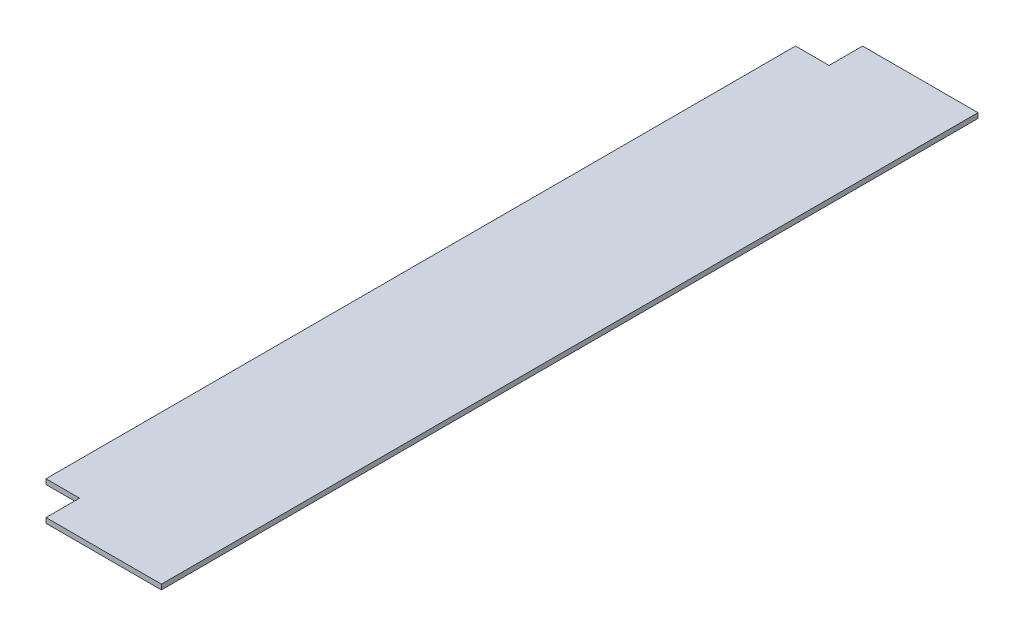
ISO-10303-21;
HEADER;
FILE_DESCRIPTION(('STEP AP214'),'2;1');
FILE_NAME('part.step','',(''),(''),'','','');
FILE_SCHEMA(('AUTOMOTIVE_DESIGN { 1 0 10303 214 1 1 1 1 }'));
ENDSEC;
DATA;
#1=APPLICATION_CONTEXT('core data for automotive mechanical design processes');
#2=APPLICATION_PROTOCOL_DEFINITION('international standard','automotive_design',2000,#1);
#3=PRODUCT_CONTEXT('',#1,'mechanical');
#4=PRODUCT('Part','Part','',(#3));
#5=PRODUCT_RELATED_PRODUCT_CATEGORY('part','',(#4));
#6=PRODUCT_DEFINITION_FORMATION('','',#4);
#7=PRODUCT_DEFINITION_CONTEXT('part definition',#1,'design');
#8=PRODUCT_DEFINITION('design','',#6,#7);
#9=PRODUCT_DEFINITION_SHAPE('','',#8);
#10=(LENGTH_UNIT() NAMED_UNIT(*) SI_UNIT(.MILLI.,.METRE.));
#11=(NAMED_UNIT(*) PLANE_ANGLE_UNIT() SI_UNIT($,.RADIAN.));
#12=(NAMED_UNIT(*) SI_UNIT($,.STERADIAN.) SOLID_ANGLE_UNIT());
#13=UNCERTAINTY_MEASURE_WITH_UNIT(LENGTH_MEASURE(1.E-05),#10,'distance_accuracy_value','');
#14=(GEOMETRIC_REPRESENTATION_CONTEXT(3) GLOBAL_UNCERTAINTY_ASSIGNED_CONTEXT((#13)) GLOBAL_UNIT_ASSIGNED_CONTEXT((#10,
#11,#12)) REPRESENTATION_CONTEXT('',''));
#15=CARTESIAN_POINT('',(0.,0.,0.));
#16=DIRECTION('',(0.,0.,1.));
#17=DIRECTION('',(1.,0.,0.));
#18=AXIS2_PLACEMENT_3D('',#15,#16,#17);
#19=CARTESIAN_POINT('',(36.1974551956955,4.5,-365.));
#20=DIRECTION('',(-1.,0.,0.));
#21=DIRECTION('',(0.,0.,1.));
#22=AXIS2_PLACEMENT_3D('',#19,#20,#21);
#23=PLANE('',#22);
#24=DIRECTION('',(0.,0.,-1.));
#25=VECTOR('',#24,1.);
#26=CARTESIAN_POINT('',(36.1974551956955,0.,-365.));
#27=LINE('',#26,#25);
#28=CARTESIAN_POINT('',(36.1974551956956,0.,365.));
#29=VERTEX_POINT('',#28);
#30=CARTESIAN_POINT('',(36.1974551956955,0.,-365.));
#31=VERTEX_POINT('',#30);
#32=EDGE_CURVE('E140',#29,#31,#27,.T.);
#33=ORIENTED_EDGE('',*,*,#32,.T.);
#34=DIRECTION('',(0.,-1.,0.));
#35=VECTOR('',#34,1.);
#36=CARTESIAN_POINT('',(36.1974551956955,4.5,-365.));
#37=LINE('',#36,#35);
#38=CARTESIAN_POINT('',(36.1974551956955,4.5,-365.));
#39=VERTEX_POINT('',#38);
#40=EDGE_CURVE('E11',#39,#31,#37,.T.);
#41=ORIENTED_EDGE('',*,*,#40,.F.);
#42=DIRECTION('',(0.,0.,-1.));
#43=VECTOR('',#42,1.);
#44=CARTESIAN_POINT('',(36.1974551956955,4.5,-365.));
#45=LINE('',#44,#43);
#46=CARTESIAN_POINT('',(36.1974551956956,4.5,365.));
#47=VERTEX_POINT('',#46);
#48=EDGE_CURVE('E162',#47,#39,#45,.T.);
#49=ORIENTED_EDGE('',*,*,#48,.F.);
#50=DIRECTION('',(0.,-1.,0.));
#51=VECTOR('',#50,1.);
#52=CARTESIAN_POINT('',(36.1974551956956,4.5,365.));
#53=LINE('',#52,#51);
#54=EDGE_CURVE('E136',#47,#29,#53,.T.);
#55=ORIENTED_EDGE('',*,*,#54,.T.);
#56=EDGE_LOOP('',(#33,#41,#49,#55));
#57=FACE_BOUND('',#56,.T.);
#58=ADVANCED_FACE('F39',(#57),#23,.F.);
#59=CARTESIAN_POINT('',(-66.9625448043045,4.5,-365.));
#60=DIRECTION('',(0.,0.,1.));
#61=DIRECTION('',(1.,0.,0.));
#62=AXIS2_PLACEMENT_3D('',#59,#60,#61);
#63=PLANE('',#62);
#64=DIRECTION('',(-1.,0.,0.));
#65=VECTOR('',#64,1.);
#66=CARTESIAN_POINT('',(-66.9625448043045,0.,-365.));
#67=LINE('',#66,#65);
#68=CARTESIAN_POINT('',(-66.9625448043045,0.,-365.));
#69=VERTEX_POINT('',#68);
#70=EDGE_CURVE('E144',#31,#69,#67,.T.);
#71=ORIENTED_EDGE('',*,*,#70,.T.);
#72=DIRECTION('',(0.,-1.,0.));
#73=VECTOR('',#72,1.);
#74=CARTESIAN_POINT('',(-66.9625448043045,4.5,-365.));
#75=LINE('',#74,#73);
#76=CARTESIAN_POINT('',(-66.9625448043045,4.5,-365.));
#77=VERTEX_POINT('',#76);
#78=EDGE_CURVE('E48',#77,#69,#75,.T.);
#79=ORIENTED_EDGE('',*,*,#78,.F.);
#80=DIRECTION('',(-1.,0.,0.));
#81=VECTOR('',#80,1.);
#82=CARTESIAN_POINT('',(-66.9625448043045,4.5,-365.));
#83=LINE('',#82,#81);
#84=EDGE_CURVE('E99',#39,#77,#83,.T.);
#85=ORIENTED_EDGE('',*,*,#84,.F.);
#86=ORIENTED_EDGE('',*,*,#40,.T.);
#87=EDGE_LOOP('',(#71,#79,#85,#86));
#88=FACE_BOUND('',#87,.T.);
#89=ADVANCED_FACE('F208',(#88),#63,.F.);
#90=CARTESIAN_POINT('',(-66.9625448043045,4.5,-365.));
#91=DIRECTION('',(1.,0.,0.));
#92=DIRECTION('',(0.,0.,-1.));
#93=AXIS2_PLACEMENT_3D('',#90,#91,#92);
#94=PLANE('',#93);
#95=DIRECTION('',(0.,0.,1.));
#96=VECTOR('',#95,1.);
#97=CARTESIAN_POINT('',(-66.9625448043045,0.,-365.));
#98=LINE('',#97,#96);
#99=CARTESIAN_POINT('',(-66.9625448043045,0.,-335.));
#100=VERTEX_POINT('',#99);
#101=EDGE_CURVE('E147',#69,#100,#98,.T.);
#102=ORIENTED_EDGE('',*,*,#101,.T.);
#103=DIRECTION('',(0.,-1.,0.));
#104=VECTOR('',#103,1.);
#105=CARTESIAN_POINT('',(-66.9625448043045,4.5,-335.));
#106=LINE('',#105,#104);
#107=CARTESIAN_POINT('',(-66.9625448043045,4.5,-335.));
#108=VERTEX_POINT('',#107);
#109=EDGE_CURVE('E173',#108,#100,#106,.T.);
#110=ORIENTED_EDGE('',*,*,#109,.F.);
#111=DIRECTION('',(0.,0.,1.));
#112=VECTOR('',#111,1.);
#113=CARTESIAN_POINT('',(-66.9625448043045,4.5,-365.));
#114=LINE('',#113,#112);
#115=EDGE_CURVE('E183',#77,#108,#114,.T.);
#116=ORIENTED_EDGE('',*,*,#115,.F.);
#117=ORIENTED_EDGE('',*,*,#78,.T.);
#118=EDGE_LOOP('',(#102,#110,#116,#117));
#119=FACE_BOUND('',#118,.T.);
#120=ADVANCED_FACE('F181',(#119),#94,.F.);
#121=CARTESIAN_POINT('',(-96.9625448043045,4.5,-335.));
#122=DIRECTION('',(0.,0.,1.));
#123=DIRECTION('',(1.,0.,0.));
#124=AXIS2_PLACEMENT_3D('',#121,#122,#123);
#125=PLANE('',#124);
#126=DIRECTION('',(-1.,0.,0.));
#127=VECTOR('',#126,1.);
#128=CARTESIAN_POINT('',(-96.9625448043045,0.,-335.));
#129=LINE('',#128,#127);
#130=CARTESIAN_POINT('',(-96.9625448043045,0.,-335.));
#131=VERTEX_POINT('',#130);
#132=EDGE_CURVE('E150',#100,#131,#129,.T.);
#133=ORIENTED_EDGE('',*,*,#132,.T.);
#134=DIRECTION('',(0.,-1.,0.));
#135=VECTOR('',#134,1.);
#136=CARTESIAN_POINT('',(-96.9625448043045,4.5,-335.));
#137=LINE('',#136,#135);
#138=CARTESIAN_POINT('',(-96.9625448043045,4.5,-335.));
#139=VERTEX_POINT('',#138);
#140=EDGE_CURVE('E169',#139,#131,#137,.T.);
#141=ORIENTED_EDGE('',*,*,#140,.F.);
#142=DIRECTION('',(-1.,0.,0.));
#143=VECTOR('',#142,1.);
#144=CARTESIAN_POINT('',(-96.9625448043045,4.5,-335.));
#145=LINE('',#144,#143);
#146=EDGE_CURVE('E196',#108,#139,#145,.T.);
#147=ORIENTED_EDGE('',*,*,#146,.F.);
#148=ORIENTED_EDGE('',*,*,#109,.T.);
#149=EDGE_LOOP('',(#133,#141,#147,#148));
#150=FACE_BOUND('',#149,.T.);
#151=ADVANCED_FACE('F191',(#150),#125,.F.);
#152=CARTESIAN_POINT('',(-96.9625448043045,4.5,-335.));
#153=DIRECTION('',(1.,0.,0.));
#154=DIRECTION('',(0.,0.,-1.));
#155=AXIS2_PLACEMENT_3D('',#152,#153,#154);
#156=PLANE('',#155);
#157=DIRECTION('',(0.,0.,1.));
#158=VECTOR('',#157,1.);
#159=CARTESIAN_POINT('',(-96.9625448043045,0.,-335.));
#160=LINE('',#159,#158);
#161=CARTESIAN_POINT('',(-96.9625448043044,0.,335.));
#162=VERTEX_POINT('',#161);
#163=EDGE_CURVE('E153',#131,#162,#160,.T.);
#164=ORIENTED_EDGE('',*,*,#163,.T.);
#165=DIRECTION('',(0.,-1.,0.));
#166=VECTOR('',#165,1.);
#167=CARTESIAN_POINT('',(-96.9625448043044,4.5,335.));
#168=LINE('',#167,#166);
#169=CARTESIAN_POINT('',(-96.9625448043044,4.5,335.));
#170=VERTEX_POINT('',#169);
#171=EDGE_CURVE('E129',#170,#162,#168,.T.);
#172=ORIENTED_EDGE('',*,*,#171,.F.);
#173=DIRECTION('',(0.,0.,1.));
#174=VECTOR('',#173,1.);
#175=CARTESIAN_POINT('',(-96.9625448043045,4.5,-335.));
#176=LINE('',#175,#174);
#177=EDGE_CURVE('E118',#139,#170,#176,.T.);
#178=ORIENTED_EDGE('',*,*,#177,.F.);
#179=ORIENTED_EDGE('',*,*,#140,.T.);
#180=EDGE_LOOP('',(#164,#172,#178,#179));
#181=FACE_BOUND('',#180,.T.);
#182=ADVANCED_FACE('F194',(#181),#156,.F.);
#183=CARTESIAN_POINT('',(-96.9625448043044,4.5,335.));
#184=DIRECTION('',(0.,0.,-1.));
#185=DIRECTION('',(-1.,0.,0.));
#186=AXIS2_PLACEMENT_3D('',#183,#184,#185);
#187=PLANE('',#186);
#188=DIRECTION('',(1.,0.,0.));
#189=VECTOR('',#188,1.);
#190=CARTESIAN_POINT('',(-96.9625448043044,0.,335.));
#191=LINE('',#190,#189);
#192=CARTESIAN_POINT('',(-66.9625448043045,0.,335.));
#193=VERTEX_POINT('',#192);
#194=EDGE_CURVE('E127',#162,#193,#191,.T.);
#195=ORIENTED_EDGE('',*,*,#194,.T.);
#196=DIRECTION('',(0.,-1.,0.));
#197=VECTOR('',#196,1.);
#198=CARTESIAN_POINT('',(-66.9625448043045,4.5,335.));
#199=LINE('',#198,#197);
#200=CARTESIAN_POINT('',(-66.9625448043045,4.5,335.));
#201=VERTEX_POINT('',#200);
#202=EDGE_CURVE('E124',#201,#193,#199,.T.);
#203=ORIENTED_EDGE('',*,*,#202,.F.);
#204=DIRECTION('',(1.,0.,0.));
#205=VECTOR('',#204,1.);
#206=CARTESIAN_POINT('',(-96.9625448043044,4.5,335.));
#207=LINE('',#206,#205);
#208=EDGE_CURVE('E112',#170,#201,#207,.T.);
#209=ORIENTED_EDGE('',*,*,#208,.F.);
#210=ORIENTED_EDGE('',*,*,#171,.T.);
#211=EDGE_LOOP('',(#195,#203,#209,#210));
#212=FACE_BOUND('',#211,.T.);
#213=ADVANCED_FACE('F125',(#212),#187,.F.);
#214=CARTESIAN_POINT('',(-66.9625448043045,4.5,365.));
#215=DIRECTION('',(1.,0.,0.));
#216=DIRECTION('',(0.,0.,-1.));
#217=AXIS2_PLACEMENT_3D('',#214,#215,#216);
#218=PLANE('',#217);
#219=DIRECTION('',(0.,0.,1.));
#220=VECTOR('',#219,1.);
#221=CARTESIAN_POINT('',(-66.9625448043045,0.,365.));
#222=LINE('',#221,#220);
#223=CARTESIAN_POINT('',(-66.9625448043045,0.,365.));
#224=VERTEX_POINT('',#223);
#225=EDGE_CURVE('E85',#193,#224,#222,.T.);
#226=ORIENTED_EDGE('',*,*,#225,.T.);
#227=DIRECTION('',(0.,-1.,0.));
#228=VECTOR('',#227,1.);
#229=CARTESIAN_POINT('',(-66.9625448043045,4.5,365.));
#230=LINE('',#229,#228);
#231=CARTESIAN_POINT('',(-66.9625448043045,4.5,365.));
#232=VERTEX_POINT('',#231);
#233=EDGE_CURVE('E130',#232,#224,#230,.T.);
#234=ORIENTED_EDGE('',*,*,#233,.F.);
#235=DIRECTION('',(0.,0.,1.));
#236=VECTOR('',#235,1.);
#237=CARTESIAN_POINT('',(-66.9625448043045,4.5,365.));
#238=LINE('',#237,#236);
#239=EDGE_CURVE('E116',#201,#232,#238,.T.);
#240=ORIENTED_EDGE('',*,*,#239,.F.);
#241=ORIENTED_EDGE('',*,*,#202,.T.);
#242=EDGE_LOOP('',(#226,#234,#240,#241));
#243=FACE_BOUND('',#242,.T.);
#244=ADVANCED_FACE('F132',(#243),#218,.F.);
#245=CARTESIAN_POINT('',(-66.9625448043045,4.5,365.));
#246=DIRECTION('',(0.,0.,-1.));
#247=DIRECTION('',(-1.,0.,0.));
#248=AXIS2_PLACEMENT_3D('',#245,#246,#247);
#249=PLANE('',#248);
#250=DIRECTION('',(1.,0.,0.));
#251=VECTOR('',#250,1.);
#252=CARTESIAN_POINT('',(-66.9625448043045,0.,365.));
#253=LINE('',#252,#251);
#254=EDGE_CURVE('E91',#224,#29,#253,.T.);
#255=ORIENTED_EDGE('',*,*,#254,.T.);
#256=ORIENTED_EDGE('',*,*,#54,.F.);
#257=DIRECTION('',(1.,0.,0.));
#258=VECTOR('',#257,1.);
#259=CARTESIAN_POINT('',(-66.9625448043045,4.5,365.));
#260=LINE('',#259,#258);
#261=EDGE_CURVE('E56',#232,#47,#260,.T.);
#262=ORIENTED_EDGE('',*,*,#261,.F.);
#263=ORIENTED_EDGE('',*,*,#233,.T.);
#264=EDGE_LOOP('',(#255,#256,#262,#263));
#265=FACE_BOUND('',#264,.T.);
#266=ADVANCED_FACE('F224',(#265),#249,.F.);
#267=CARTESIAN_POINT('',(0.,4.5,0.));
#268=DIRECTION('',(0.,1.,0.));
#269=DIRECTION('',(0.,0.,1.));
#270=AXIS2_PLACEMENT_3D('',#267,#268,#269);
#271=PLANE('',#270);
#272=ORIENTED_EDGE('',*,*,#48,.T.);
#273=ORIENTED_EDGE('',*,*,#84,.T.);
#274=ORIENTED_EDGE('',*,*,#115,.T.);
#275=ORIENTED_EDGE('',*,*,#146,.T.);
#276=ORIENTED_EDGE('',*,*,#177,.T.);
#277=ORIENTED_EDGE('',*,*,#208,.T.);
#278=ORIENTED_EDGE('',*,*,#239,.T.);
#279=ORIENTED_EDGE('',*,*,#261,.T.);
#280=EDGE_LOOP('',(#272,#273,#274,#275,#276,#277,#278,#279));
#281=FACE_BOUND('',#280,.T.);
#282=ADVANCED_FACE('F114',(#281),#271,.T.);
#283=CARTESIAN_POINT('',(0.,0.,0.));
#284=DIRECTION('',(0.,1.,0.));
#285=DIRECTION('',(0.,0.,1.));
#286=AXIS2_PLACEMENT_3D('',#283,#284,#285);
#287=PLANE('',#286);
#288=ORIENTED_EDGE('',*,*,#32,.F.);
#289=ORIENTED_EDGE('',*,*,#254,.F.);
#290=ORIENTED_EDGE('',*,*,#225,.F.);
#291=ORIENTED_EDGE('',*,*,#194,.F.);
#292=ORIENTED_EDGE('',*,*,#163,.F.);
#293=ORIENTED_EDGE('',*,*,#132,.F.);
#294=ORIENTED_EDGE('',*,*,#101,.F.);
#295=ORIENTED_EDGE('',*,*,#70,.F.);
#296=EDGE_LOOP('',(#288,#289,#290,#291,#292,#293,#294,#295));
#297=FACE_BOUND('',#296,.T.);
#298=ADVANCED_FACE('F187',(#297),#287,.F.);
#299=CLOSED_SHELL('',(#58,#89,#120,#151,#182,#213,#244,#266,#282,#298));
#300=MANIFOLD_SOLID_BREP('B2',#299);
#301=ADVANCED_BREP_SHAPE_REPRESENTATION('',(#18,#300),#14);
#302=SHAPE_DEFINITION_REPRESENTATION(#9,#301);
ENDSEC;
END-ISO-10303-21;
